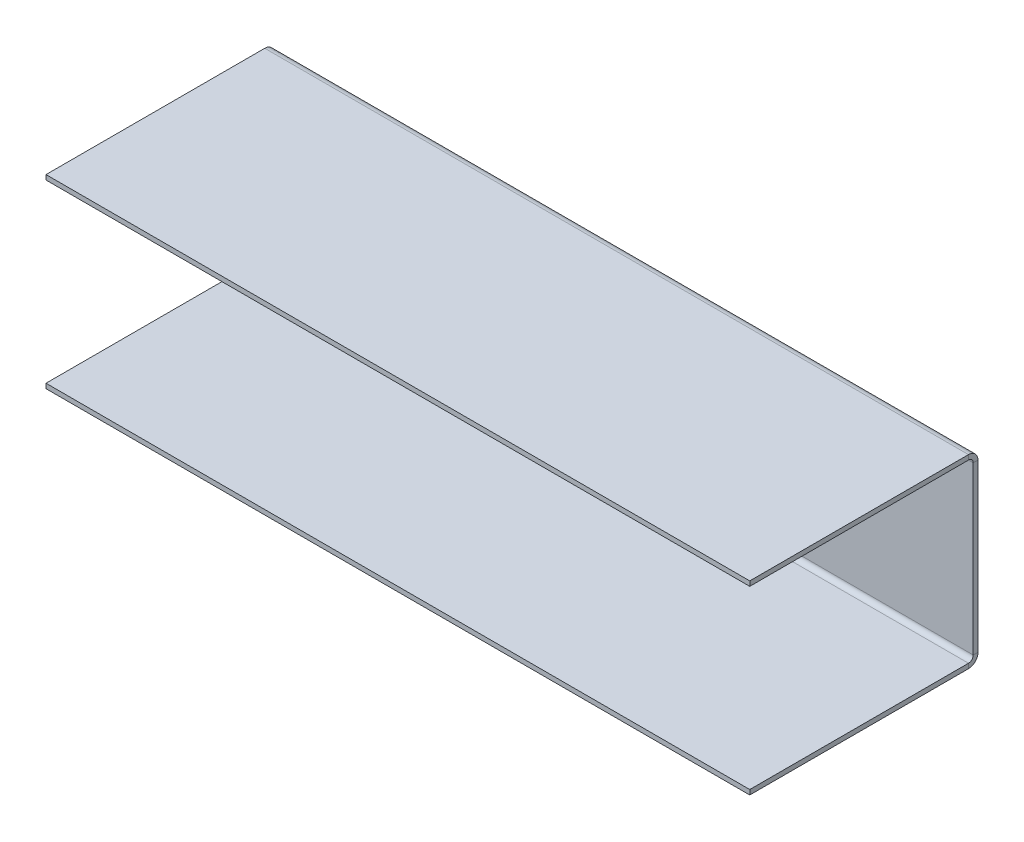
ISO-10303-21;
HEADER;
FILE_DESCRIPTION(('STEP AP214'),'2;1');
FILE_NAME('part.step','',(''),(''),'','','');
FILE_SCHEMA(('AUTOMOTIVE_DESIGN { 1 0 10303 214 1 1 1 1 }'));
ENDSEC;
DATA;
#1=APPLICATION_CONTEXT('core data for automotive mechanical design processes');
#2=APPLICATION_PROTOCOL_DEFINITION('international standard','automotive_design',2000,#1);
#3=PRODUCT_CONTEXT('',#1,'mechanical');
#4=PRODUCT('Part','Part','',(#3));
#5=PRODUCT_RELATED_PRODUCT_CATEGORY('part','',(#4));
#6=PRODUCT_DEFINITION_FORMATION('','',#4);
#7=PRODUCT_DEFINITION_CONTEXT('part definition',#1,'design');
#8=PRODUCT_DEFINITION('design','',#6,#7);
#9=PRODUCT_DEFINITION_SHAPE('','',#8);
#10=(LENGTH_UNIT() NAMED_UNIT(*) SI_UNIT(.MILLI.,.METRE.));
#11=(NAMED_UNIT(*) PLANE_ANGLE_UNIT() SI_UNIT($,.RADIAN.));
#12=(NAMED_UNIT(*) SI_UNIT($,.STERADIAN.) SOLID_ANGLE_UNIT());
#13=UNCERTAINTY_MEASURE_WITH_UNIT(LENGTH_MEASURE(1.E-05),#10,'distance_accuracy_value','');
#14=(GEOMETRIC_REPRESENTATION_CONTEXT(3) GLOBAL_UNCERTAINTY_ASSIGNED_CONTEXT((#13)) GLOBAL_UNIT_ASSIGNED_CONTEXT((#10,
#11,#12)) REPRESENTATION_CONTEXT('',''));
#15=CARTESIAN_POINT('',(0.,0.,0.));
#16=DIRECTION('',(0.,0.,1.));
#17=DIRECTION('',(1.,0.,0.));
#18=AXIS2_PLACEMENT_3D('',#15,#16,#17);
#19=CARTESIAN_POINT('',(469.9,0.,-146.05));
#20=DIRECTION('',(1.,0.,0.));
#21=DIRECTION('',(0.,0.,-1.));
#22=AXIS2_PLACEMENT_3D('',#19,#20,#21);
#23=PLANE('',#22);
#24=DIRECTION('',(0.,1.,0.));
#25=VECTOR('',#24,1.);
#26=CARTESIAN_POINT('',(469.9,0.,-146.05));
#27=LINE('',#26,#25);
#28=CARTESIAN_POINT('',(469.9,0.,-146.05));
#29=VERTEX_POINT('',#28);
#30=CARTESIAN_POINT('',(469.9,3.175,-146.05));
#31=VERTEX_POINT('',#30);
#32=EDGE_CURVE('E11',#29,#31,#27,.T.);
#33=ORIENTED_EDGE('',*,*,#32,.F.);
#34=CARTESIAN_POINT('',(469.9,6.35,-146.05));
#35=DIRECTION('',(-1.,0.,0.));
#36=DIRECTION('',(0.,0.,1.));
#37=AXIS2_PLACEMENT_3D('',#34,#35,#36);
#38=CIRCLE('',#37,6.35);
#39=CARTESIAN_POINT('',(469.9,6.35,-152.4));
#40=VERTEX_POINT('',#39);
#41=EDGE_CURVE('E147',#29,#40,#38,.F.);
#42=ORIENTED_EDGE('',*,*,#41,.T.);
#43=DIRECTION('',(0.,0.,-1.));
#44=VECTOR('',#43,1.);
#45=CARTESIAN_POINT('',(469.9,6.35,-149.225));
#46=LINE('',#45,#44);
#47=CARTESIAN_POINT('',(469.9,6.35,-149.225));
#48=VERTEX_POINT('',#47);
#49=EDGE_CURVE('E45',#48,#40,#46,.T.);
#50=ORIENTED_EDGE('',*,*,#49,.F.);
#51=CARTESIAN_POINT('',(469.9,6.35,-146.05));
#52=DIRECTION('',(1.,0.,0.));
#53=DIRECTION('',(0.,0.,-1.));
#54=AXIS2_PLACEMENT_3D('',#51,#52,#53);
#55=CIRCLE('',#54,3.175);
#56=EDGE_CURVE('E241',#31,#48,#55,.T.);
#57=ORIENTED_EDGE('',*,*,#56,.F.);
#58=EDGE_LOOP('',(#33,#42,#50,#57));
#59=FACE_BOUND('',#58,.T.);
#60=ADVANCED_FACE('F37',(#59),#23,.T.);
#61=CARTESIAN_POINT('',(469.9,6.35,-149.225));
#62=DIRECTION('',(1.,0.,0.));
#63=DIRECTION('',(0.,0.,-1.));
#64=AXIS2_PLACEMENT_3D('',#61,#62,#63);
#65=PLANE('',#64);
#66=DIRECTION('',(0.,0.,-1.));
#67=VECTOR('',#66,1.);
#68=CARTESIAN_POINT('',(469.9,0.,0.));
#69=LINE('',#68,#67);
#70=CARTESIAN_POINT('',(469.9,0.,0.));
#71=VERTEX_POINT('',#70);
#72=EDGE_CURVE('E152',#71,#29,#69,.T.);
#73=ORIENTED_EDGE('',*,*,#72,.T.);
#74=ORIENTED_EDGE('',*,*,#32,.T.);
#75=DIRECTION('',(0.,0.,-1.));
#76=VECTOR('',#75,1.);
#77=CARTESIAN_POINT('',(469.9,3.175,0.));
#78=LINE('',#77,#76);
#79=CARTESIAN_POINT('',(469.9,3.175,0.));
#80=VERTEX_POINT('',#79);
#81=EDGE_CURVE('E254',#80,#31,#78,.T.);
#82=ORIENTED_EDGE('',*,*,#81,.F.);
#83=DIRECTION('',(0.,1.,0.));
#84=VECTOR('',#83,1.);
#85=CARTESIAN_POINT('',(469.9,0.,0.));
#86=LINE('',#85,#84);
#87=EDGE_CURVE('E256',#71,#80,#86,.T.);
#88=ORIENTED_EDGE('',*,*,#87,.F.);
#89=EDGE_LOOP('',(#73,#74,#82,#88));
#90=FACE_BOUND('',#89,.T.);
#91=ADVANCED_FACE('F267',(#90),#65,.T.);
#92=CARTESIAN_POINT('',(0.,6.35,-152.4));
#93=DIRECTION('',(-1.,0.,0.));
#94=DIRECTION('',(0.,0.,1.));
#95=AXIS2_PLACEMENT_3D('',#92,#93,#94);
#96=PLANE('',#95);
#97=DIRECTION('',(0.,0.,1.));
#98=VECTOR('',#97,1.);
#99=CARTESIAN_POINT('',(0.,6.35,-152.4));
#100=LINE('',#99,#98);
#101=CARTESIAN_POINT('',(0.,6.35,-152.4));
#102=VERTEX_POINT('',#101);
#103=CARTESIAN_POINT('',(0.,6.35,-149.225));
#104=VERTEX_POINT('',#103);
#105=EDGE_CURVE('E145',#102,#104,#100,.T.);
#106=ORIENTED_EDGE('',*,*,#105,.F.);
#107=CARTESIAN_POINT('',(0.,6.35,-146.05));
#108=DIRECTION('',(-1.,0.,0.));
#109=DIRECTION('',(0.,0.,1.));
#110=AXIS2_PLACEMENT_3D('',#107,#108,#109);
#111=CIRCLE('',#110,6.35);
#112=CARTESIAN_POINT('',(0.,0.,-146.05));
#113=VERTEX_POINT('',#112);
#114=EDGE_CURVE('E159',#113,#102,#111,.F.);
#115=ORIENTED_EDGE('',*,*,#114,.F.);
#116=DIRECTION('',(0.,-1.,0.));
#117=VECTOR('',#116,1.);
#118=CARTESIAN_POINT('',(0.,3.175,-146.05));
#119=LINE('',#118,#117);
#120=CARTESIAN_POINT('',(0.,3.175,-146.05));
#121=VERTEX_POINT('',#120);
#122=EDGE_CURVE('E232',#121,#113,#119,.T.);
#123=ORIENTED_EDGE('',*,*,#122,.F.);
#124=CARTESIAN_POINT('',(0.,6.35,-146.05));
#125=DIRECTION('',(1.,0.,0.));
#126=DIRECTION('',(0.,0.,-1.));
#127=AXIS2_PLACEMENT_3D('',#124,#125,#126);
#128=CIRCLE('',#127,3.175);
#129=EDGE_CURVE('E186',#121,#104,#128,.T.);
#130=ORIENTED_EDGE('',*,*,#129,.T.);
#131=EDGE_LOOP('',(#106,#115,#123,#130));
#132=FACE_BOUND('',#131,.T.);
#133=ADVANCED_FACE('F246',(#132),#96,.T.);
#134=CARTESIAN_POINT('',(0.,3.175,-146.05));
#135=DIRECTION('',(-1.,0.,0.));
#136=DIRECTION('',(0.,0.,1.));
#137=AXIS2_PLACEMENT_3D('',#134,#135,#136);
#138=PLANE('',#137);
#139=DIRECTION('',(0.,1.,0.));
#140=VECTOR('',#139,1.);
#141=CARTESIAN_POINT('',(0.,0.,-152.4));
#142=LINE('',#141,#140);
#143=CARTESIAN_POINT('',(0.,117.475,-152.4));
#144=VERTEX_POINT('',#143);
#145=EDGE_CURVE('E199',#102,#144,#142,.T.);
#146=ORIENTED_EDGE('',*,*,#145,.F.);
#147=ORIENTED_EDGE('',*,*,#105,.T.);
#148=DIRECTION('',(0.,1.,0.));
#149=VECTOR('',#148,1.);
#150=CARTESIAN_POINT('',(0.,0.,-149.225));
#151=LINE('',#150,#149);
#152=CARTESIAN_POINT('',(0.,117.475,-149.225));
#153=VERTEX_POINT('',#152);
#154=EDGE_CURVE('E184',#104,#153,#151,.T.);
#155=ORIENTED_EDGE('',*,*,#154,.T.);
#156=DIRECTION('',(0.,0.,-1.));
#157=VECTOR('',#156,1.);
#158=CARTESIAN_POINT('',(0.,117.475,-149.225));
#159=LINE('',#158,#157);
#160=EDGE_CURVE('E94',#153,#144,#159,.T.);
#161=ORIENTED_EDGE('',*,*,#160,.T.);
#162=EDGE_LOOP('',(#146,#147,#155,#161));
#163=FACE_BOUND('',#162,.T.);
#164=ADVANCED_FACE('F234',(#163),#138,.T.);
#165=CARTESIAN_POINT('',(469.9,117.475,-152.4));
#166=DIRECTION('',(1.,0.,0.));
#167=DIRECTION('',(0.,0.,-1.));
#168=AXIS2_PLACEMENT_3D('',#165,#166,#167);
#169=PLANE('',#168);
#170=DIRECTION('',(0.,0.,1.));
#171=VECTOR('',#170,1.);
#172=CARTESIAN_POINT('',(469.9,117.475,-152.4));
#173=LINE('',#172,#171);
#174=CARTESIAN_POINT('',(469.9,117.475,-152.4));
#175=VERTEX_POINT('',#174);
#176=CARTESIAN_POINT('',(469.9,117.475,-149.225));
#177=VERTEX_POINT('',#176);
#178=EDGE_CURVE('E230',#175,#177,#173,.T.);
#179=ORIENTED_EDGE('',*,*,#178,.F.);
#180=CARTESIAN_POINT('',(469.9,117.475,-146.05));
#181=DIRECTION('',(-1.,0.,0.));
#182=DIRECTION('',(0.,0.,1.));
#183=AXIS2_PLACEMENT_3D('',#180,#181,#182);
#184=CIRCLE('',#183,6.35);
#185=CARTESIAN_POINT('',(469.9,123.825,-146.05));
#186=VERTEX_POINT('',#185);
#187=EDGE_CURVE('E167',#175,#186,#184,.F.);
#188=ORIENTED_EDGE('',*,*,#187,.T.);
#189=DIRECTION('',(0.,1.,0.));
#190=VECTOR('',#189,1.);
#191=CARTESIAN_POINT('',(469.9,120.65,-146.05));
#192=LINE('',#191,#190);
#193=CARTESIAN_POINT('',(469.9,120.65,-146.05));
#194=VERTEX_POINT('',#193);
#195=EDGE_CURVE('E53',#194,#186,#192,.T.);
#196=ORIENTED_EDGE('',*,*,#195,.F.);
#197=CARTESIAN_POINT('',(469.9,117.475,-146.05));
#198=DIRECTION('',(1.,0.,0.));
#199=DIRECTION('',(0.,0.,-1.));
#200=AXIS2_PLACEMENT_3D('',#197,#198,#199);
#201=CIRCLE('',#200,3.175);
#202=EDGE_CURVE('E258',#177,#194,#201,.T.);
#203=ORIENTED_EDGE('',*,*,#202,.F.);
#204=EDGE_LOOP('',(#179,#188,#196,#203));
#205=FACE_BOUND('',#204,.T.);
#206=ADVANCED_FACE('F293',(#205),#169,.T.);
#207=CARTESIAN_POINT('',(469.9,120.65,-146.05));
#208=DIRECTION('',(1.,0.,0.));
#209=DIRECTION('',(0.,0.,-1.));
#210=AXIS2_PLACEMENT_3D('',#207,#208,#209);
#211=PLANE('',#210);
#212=DIRECTION('',(0.,1.,0.));
#213=VECTOR('',#212,1.);
#214=CARTESIAN_POINT('',(469.9,0.,-152.4));
#215=LINE('',#214,#213);
#216=EDGE_CURVE('E137',#40,#175,#215,.T.);
#217=ORIENTED_EDGE('',*,*,#216,.T.);
#218=ORIENTED_EDGE('',*,*,#178,.T.);
#219=DIRECTION('',(0.,1.,0.));
#220=VECTOR('',#219,1.);
#221=CARTESIAN_POINT('',(469.9,0.,-149.225));
#222=LINE('',#221,#220);
#223=EDGE_CURVE('E140',#48,#177,#222,.T.);
#224=ORIENTED_EDGE('',*,*,#223,.F.);
#225=ORIENTED_EDGE('',*,*,#49,.T.);
#226=EDGE_LOOP('',(#217,#218,#224,#225));
#227=FACE_BOUND('',#226,.T.);
#228=ADVANCED_FACE('F135',(#227),#211,.T.);
#229=CARTESIAN_POINT('',(0.,123.825,-146.05));
#230=DIRECTION('',(-1.,0.,0.));
#231=DIRECTION('',(0.,0.,1.));
#232=AXIS2_PLACEMENT_3D('',#229,#230,#231);
#233=PLANE('',#232);
#234=DIRECTION('',(0.,-1.,0.));
#235=VECTOR('',#234,1.);
#236=CARTESIAN_POINT('',(0.,123.825,-146.05));
#237=LINE('',#236,#235);
#238=CARTESIAN_POINT('',(0.,123.825,-146.05));
#239=VERTEX_POINT('',#238);
#240=CARTESIAN_POINT('',(0.,120.65,-146.05));
#241=VERTEX_POINT('',#240);
#242=EDGE_CURVE('E101',#239,#241,#237,.T.);
#243=ORIENTED_EDGE('',*,*,#242,.F.);
#244=CARTESIAN_POINT('',(0.,117.475,-146.05));
#245=DIRECTION('',(-1.,0.,0.));
#246=DIRECTION('',(0.,0.,1.));
#247=AXIS2_PLACEMENT_3D('',#244,#245,#246);
#248=CIRCLE('',#247,6.35);
#249=EDGE_CURVE('E201',#144,#239,#248,.F.);
#250=ORIENTED_EDGE('',*,*,#249,.F.);
#251=ORIENTED_EDGE('',*,*,#160,.F.);
#252=CARTESIAN_POINT('',(0.,117.475,-146.05));
#253=DIRECTION('',(1.,0.,0.));
#254=DIRECTION('',(0.,0.,-1.));
#255=AXIS2_PLACEMENT_3D('',#252,#253,#254);
#256=CIRCLE('',#255,3.175);
#257=EDGE_CURVE('E182',#153,#241,#256,.T.);
#258=ORIENTED_EDGE('',*,*,#257,.T.);
#259=EDGE_LOOP('',(#243,#250,#251,#258));
#260=FACE_BOUND('',#259,.T.);
#261=ADVANCED_FACE('F299',(#260),#233,.T.);
#262=CARTESIAN_POINT('',(0.,117.475,-149.225));
#263=DIRECTION('',(-1.,0.,0.));
#264=DIRECTION('',(0.,0.,1.));
#265=AXIS2_PLACEMENT_3D('',#262,#263,#264);
#266=PLANE('',#265);
#267=DIRECTION('',(0.,0.,1.));
#268=VECTOR('',#267,1.);
#269=CARTESIAN_POINT('',(0.,123.825,-152.4));
#270=LINE('',#269,#268);
#271=CARTESIAN_POINT('',(0.,123.825,0.));
#272=VERTEX_POINT('',#271);
#273=EDGE_CURVE('E173',#239,#272,#270,.T.);
#274=ORIENTED_EDGE('',*,*,#273,.F.);
#275=ORIENTED_EDGE('',*,*,#242,.T.);
#276=DIRECTION('',(0.,0.,-1.));
#277=VECTOR('',#276,1.);
#278=CARTESIAN_POINT('',(0.,120.65,-152.4));
#279=LINE('',#278,#277);
#280=CARTESIAN_POINT('',(0.,120.65,0.));
#281=VERTEX_POINT('',#280);
#282=EDGE_CURVE('E179',#241,#281,#279,.F.);
#283=ORIENTED_EDGE('',*,*,#282,.T.);
#284=DIRECTION('',(0.,1.,0.));
#285=VECTOR('',#284,1.);
#286=CARTESIAN_POINT('',(0.,120.65,0.));
#287=LINE('',#286,#285);
#288=EDGE_CURVE('E176',#281,#272,#287,.T.);
#289=ORIENTED_EDGE('',*,*,#288,.T.);
#290=EDGE_LOOP('',(#274,#275,#283,#289));
#291=FACE_BOUND('',#290,.T.);
#292=ADVANCED_FACE('F302',(#291),#266,.T.);
#293=CARTESIAN_POINT('',(469.9,123.825,-152.4));
#294=DIRECTION('',(0.,-1.,0.));
#295=DIRECTION('',(0.,0.,-1.));
#296=AXIS2_PLACEMENT_3D('',#293,#294,#295);
#297=PLANE('',#296);
#298=ORIENTED_EDGE('',*,*,#273,.T.);
#299=DIRECTION('',(-1.,0.,0.));
#300=VECTOR('',#299,1.);
#301=CARTESIAN_POINT('',(469.9,123.825,0.));
#302=LINE('',#301,#300);
#303=CARTESIAN_POINT('',(469.9,123.825,0.));
#304=VERTEX_POINT('',#303);
#305=EDGE_CURVE('E225',#304,#272,#302,.T.);
#306=ORIENTED_EDGE('',*,*,#305,.F.);
#307=DIRECTION('',(0.,0.,1.));
#308=VECTOR('',#307,1.);
#309=CARTESIAN_POINT('',(469.9,123.825,-152.4));
#310=LINE('',#309,#308);
#311=EDGE_CURVE('E107',#186,#304,#310,.T.);
#312=ORIENTED_EDGE('',*,*,#311,.F.);
#313=DIRECTION('',(-1.,0.,0.));
#314=VECTOR('',#313,1.);
#315=CARTESIAN_POINT('',(469.9,123.825,-146.05));
#316=LINE('',#315,#314);
#317=EDGE_CURVE('E169',#186,#239,#316,.T.);
#318=ORIENTED_EDGE('',*,*,#317,.T.);
#319=EDGE_LOOP('',(#298,#306,#312,#318));
#320=FACE_BOUND('',#319,.T.);
#321=ADVANCED_FACE('F305',(#320),#297,.F.);
#322=CARTESIAN_POINT('',(469.9,120.65,0.));
#323=DIRECTION('',(0.,0.,1.));
#324=DIRECTION('',(0.,-1.,0.));
#325=AXIS2_PLACEMENT_3D('',#322,#323,#324);
#326=PLANE('',#325);
#327=ORIENTED_EDGE('',*,*,#288,.F.);
#328=DIRECTION('',(-1.,0.,0.));
#329=VECTOR('',#328,1.);
#330=CARTESIAN_POINT('',(469.9,120.65,0.));
#331=LINE('',#330,#329);
#332=CARTESIAN_POINT('',(469.9,120.65,0.));
#333=VERTEX_POINT('',#332);
#334=EDGE_CURVE('E223',#333,#281,#331,.T.);
#335=ORIENTED_EDGE('',*,*,#334,.F.);
#336=DIRECTION('',(0.,1.,0.));
#337=VECTOR('',#336,1.);
#338=CARTESIAN_POINT('',(469.9,120.65,0.));
#339=LINE('',#338,#337);
#340=EDGE_CURVE('E513',#333,#304,#339,.T.);
#341=ORIENTED_EDGE('',*,*,#340,.T.);
#342=ORIENTED_EDGE('',*,*,#305,.T.);
#343=EDGE_LOOP('',(#327,#335,#341,#342));
#344=FACE_BOUND('',#343,.T.);
#345=ADVANCED_FACE('F309',(#344),#326,.T.);
#346=CARTESIAN_POINT('',(469.9,120.65,-152.4));
#347=DIRECTION('',(0.,-1.,0.));
#348=DIRECTION('',(0.,0.,-1.));
#349=AXIS2_PLACEMENT_3D('',#346,#347,#348);
#350=PLANE('',#349);
#351=ORIENTED_EDGE('',*,*,#282,.F.);
#352=DIRECTION('',(-1.,0.,0.));
#353=VECTOR('',#352,1.);
#354=CARTESIAN_POINT('',(469.9,120.65,-146.05));
#355=LINE('',#354,#353);
#356=EDGE_CURVE('E220',#194,#241,#355,.T.);
#357=ORIENTED_EDGE('',*,*,#356,.F.);
#358=DIRECTION('',(0.,0.,-1.));
#359=VECTOR('',#358,1.);
#360=CARTESIAN_POINT('',(469.9,120.65,-152.4));
#361=LINE('',#360,#359);
#362=EDGE_CURVE('E515',#194,#333,#361,.F.);
#363=ORIENTED_EDGE('',*,*,#362,.T.);
#364=ORIENTED_EDGE('',*,*,#334,.T.);
#365=EDGE_LOOP('',(#351,#357,#363,#364));
#366=FACE_BOUND('',#365,.T.);
#367=ADVANCED_FACE('F313',(#366),#350,.T.);
#368=CARTESIAN_POINT('',(469.9,117.475,-146.05));
#369=DIRECTION('',(-1.,0.,0.));
#370=DIRECTION('',(0.,0.,1.));
#371=AXIS2_PLACEMENT_3D('',#368,#369,#370);
#372=CYLINDRICAL_SURFACE('',#371,3.175);
#373=ORIENTED_EDGE('',*,*,#257,.F.);
#374=DIRECTION('',(-1.,0.,0.));
#375=VECTOR('',#374,1.);
#376=CARTESIAN_POINT('',(469.9,117.475,-149.225));
#377=LINE('',#376,#375);
#378=EDGE_CURVE('E217',#177,#153,#377,.T.);
#379=ORIENTED_EDGE('',*,*,#378,.F.);
#380=ORIENTED_EDGE('',*,*,#202,.T.);
#381=ORIENTED_EDGE('',*,*,#356,.T.);
#382=EDGE_LOOP('',(#373,#379,#380,#381));
#383=FACE_BOUND('',#382,.T.);
#384=ADVANCED_FACE('F317',(#383),#372,.F.);
#385=CARTESIAN_POINT('',(469.9,0.,-149.225));
#386=DIRECTION('',(0.,0.,1.));
#387=DIRECTION('',(1.,0.,0.));
#388=AXIS2_PLACEMENT_3D('',#385,#386,#387);
#389=PLANE('',#388);
#390=ORIENTED_EDGE('',*,*,#154,.F.);
#391=DIRECTION('',(-1.,0.,0.));
#392=VECTOR('',#391,1.);
#393=CARTESIAN_POINT('',(469.9,6.35,-149.225));
#394=LINE('',#393,#392);
#395=EDGE_CURVE('E214',#48,#104,#394,.T.);
#396=ORIENTED_EDGE('',*,*,#395,.F.);
#397=ORIENTED_EDGE('',*,*,#223,.T.);
#398=ORIENTED_EDGE('',*,*,#378,.T.);
#399=EDGE_LOOP('',(#390,#396,#397,#398));
#400=FACE_BOUND('',#399,.T.);
#401=ADVANCED_FACE('F243',(#400),#389,.T.);
#402=CARTESIAN_POINT('',(469.9,6.35,-146.05));
#403=DIRECTION('',(-1.,0.,0.));
#404=DIRECTION('',(0.,0.,1.));
#405=AXIS2_PLACEMENT_3D('',#402,#403,#404);
#406=CYLINDRICAL_SURFACE('',#405,3.175);
#407=ORIENTED_EDGE('',*,*,#129,.F.);
#408=DIRECTION('',(-1.,0.,0.));
#409=VECTOR('',#408,1.);
#410=CARTESIAN_POINT('',(469.9,3.175,-146.05));
#411=LINE('',#410,#409);
#412=EDGE_CURVE('E211',#31,#121,#411,.T.);
#413=ORIENTED_EDGE('',*,*,#412,.F.);
#414=ORIENTED_EDGE('',*,*,#56,.T.);
#415=ORIENTED_EDGE('',*,*,#395,.T.);
#416=EDGE_LOOP('',(#407,#413,#414,#415));
#417=FACE_BOUND('',#416,.T.);
#418=ADVANCED_FACE('F239',(#417),#406,.F.);
#419=CARTESIAN_POINT('',(469.9,3.175,0.));
#420=DIRECTION('',(0.,1.,0.));
#421=DIRECTION('',(0.,0.,1.));
#422=AXIS2_PLACEMENT_3D('',#419,#420,#421);
#423=PLANE('',#422);
#424=DIRECTION('',(0.,0.,-1.));
#425=VECTOR('',#424,1.);
#426=CARTESIAN_POINT('',(0.,3.175,0.));
#427=LINE('',#426,#425);
#428=CARTESIAN_POINT('',(0.,3.175,0.));
#429=VERTEX_POINT('',#428);
#430=EDGE_CURVE('E189',#429,#121,#427,.T.);
#431=ORIENTED_EDGE('',*,*,#430,.F.);
#432=DIRECTION('',(-1.,0.,0.));
#433=VECTOR('',#432,1.);
#434=CARTESIAN_POINT('',(469.9,3.175,0.));
#435=LINE('',#434,#433);
#436=EDGE_CURVE('E209',#80,#429,#435,.T.);
#437=ORIENTED_EDGE('',*,*,#436,.F.);
#438=ORIENTED_EDGE('',*,*,#81,.T.);
#439=ORIENTED_EDGE('',*,*,#412,.T.);
#440=EDGE_LOOP('',(#431,#437,#438,#439));
#441=FACE_BOUND('',#440,.T.);
#442=ADVANCED_FACE('F252',(#441),#423,.T.);
#443=CARTESIAN_POINT('',(469.9,0.,0.));
#444=DIRECTION('',(0.,0.,1.));
#445=DIRECTION('',(1.,0.,0.));
#446=AXIS2_PLACEMENT_3D('',#443,#444,#445);
#447=PLANE('',#446);
#448=DIRECTION('',(0.,1.,0.));
#449=VECTOR('',#448,1.);
#450=CARTESIAN_POINT('',(0.,0.,0.));
#451=LINE('',#450,#449);
#452=CARTESIAN_POINT('',(0.,0.,0.));
#453=VERTEX_POINT('',#452);
#454=EDGE_CURVE('E192',#453,#429,#451,.T.);
#455=ORIENTED_EDGE('',*,*,#454,.F.);
#456=DIRECTION('',(-1.,0.,0.));
#457=VECTOR('',#456,1.);
#458=CARTESIAN_POINT('',(469.9,0.,0.));
#459=LINE('',#458,#457);
#460=EDGE_CURVE('E207',#71,#453,#459,.T.);
#461=ORIENTED_EDGE('',*,*,#460,.F.);
#462=ORIENTED_EDGE('',*,*,#87,.T.);
#463=ORIENTED_EDGE('',*,*,#436,.T.);
#464=EDGE_LOOP('',(#455,#461,#462,#463));
#465=FACE_BOUND('',#464,.T.);
#466=ADVANCED_FACE('F273',(#465),#447,.T.);
#467=CARTESIAN_POINT('',(469.9,0.,0.));
#468=DIRECTION('',(0.,1.,0.));
#469=DIRECTION('',(0.,0.,1.));
#470=AXIS2_PLACEMENT_3D('',#467,#468,#469);
#471=PLANE('',#470);
#472=DIRECTION('',(0.,0.,-1.));
#473=VECTOR('',#472,1.);
#474=CARTESIAN_POINT('',(0.,0.,0.));
#475=LINE('',#474,#473);
#476=EDGE_CURVE('E195',#453,#113,#475,.T.);
#477=ORIENTED_EDGE('',*,*,#476,.T.);
#478=DIRECTION('',(-1.,0.,0.));
#479=VECTOR('',#478,1.);
#480=CARTESIAN_POINT('',(469.9,0.,-146.05));
#481=LINE('',#480,#479);
#482=EDGE_CURVE('E161',#29,#113,#481,.T.);
#483=ORIENTED_EDGE('',*,*,#482,.F.);
#484=ORIENTED_EDGE('',*,*,#72,.F.);
#485=ORIENTED_EDGE('',*,*,#460,.T.);
#486=EDGE_LOOP('',(#477,#483,#484,#485));
#487=FACE_BOUND('',#486,.T.);
#488=ADVANCED_FACE('F269',(#487),#471,.F.);
#489=CARTESIAN_POINT('',(469.9,6.35,-146.05));
#490=DIRECTION('',(-1.,0.,0.));
#491=DIRECTION('',(0.,0.,1.));
#492=AXIS2_PLACEMENT_3D('',#489,#490,#491);
#493=CYLINDRICAL_SURFACE('',#492,6.35);
#494=ORIENTED_EDGE('',*,*,#114,.T.);
#495=DIRECTION('',(-1.,0.,0.));
#496=VECTOR('',#495,1.);
#497=CARTESIAN_POINT('',(469.9,6.35,-152.4));
#498=LINE('',#497,#496);
#499=EDGE_CURVE('E156',#40,#102,#498,.T.);
#500=ORIENTED_EDGE('',*,*,#499,.F.);
#501=ORIENTED_EDGE('',*,*,#41,.F.);
#502=ORIENTED_EDGE('',*,*,#482,.T.);
#503=EDGE_LOOP('',(#494,#500,#501,#502));
#504=FACE_BOUND('',#503,.T.);
#505=ADVANCED_FACE('F157',(#504),#493,.T.);
#506=CARTESIAN_POINT('',(469.9,0.,-152.4));
#507=DIRECTION('',(0.,0.,1.));
#508=DIRECTION('',(1.,0.,0.));
#509=AXIS2_PLACEMENT_3D('',#506,#507,#508);
#510=PLANE('',#509);
#511=ORIENTED_EDGE('',*,*,#145,.T.);
#512=DIRECTION('',(-1.,0.,0.));
#513=VECTOR('',#512,1.);
#514=CARTESIAN_POINT('',(469.9,117.475,-152.4));
#515=LINE('',#514,#513);
#516=EDGE_CURVE('E162',#175,#144,#515,.T.);
#517=ORIENTED_EDGE('',*,*,#516,.F.);
#518=ORIENTED_EDGE('',*,*,#216,.F.);
#519=ORIENTED_EDGE('',*,*,#499,.T.);
#520=EDGE_LOOP('',(#511,#517,#518,#519));
#521=FACE_BOUND('',#520,.T.);
#522=ADVANCED_FACE('F164',(#521),#510,.F.);
#523=CARTESIAN_POINT('',(469.9,117.475,-146.05));
#524=DIRECTION('',(-1.,0.,0.));
#525=DIRECTION('',(0.,0.,1.));
#526=AXIS2_PLACEMENT_3D('',#523,#524,#525);
#527=CYLINDRICAL_SURFACE('',#526,6.35);
#528=ORIENTED_EDGE('',*,*,#249,.T.);
#529=ORIENTED_EDGE('',*,*,#317,.F.);
#530=ORIENTED_EDGE('',*,*,#187,.F.);
#531=ORIENTED_EDGE('',*,*,#516,.T.);
#532=EDGE_LOOP('',(#528,#529,#530,#531));
#533=FACE_BOUND('',#532,.T.);
#534=ADVANCED_FACE('F364',(#533),#527,.T.);
#535=CARTESIAN_POINT('',(469.9,117.475,-146.05));
#536=DIRECTION('',(1.,0.,0.));
#537=DIRECTION('',(0.,0.,-1.));
#538=AXIS2_PLACEMENT_3D('',#535,#536,#537);
#539=PLANE('',#538);
#540=ORIENTED_EDGE('',*,*,#311,.T.);
#541=ORIENTED_EDGE('',*,*,#340,.F.);
#542=ORIENTED_EDGE('',*,*,#362,.F.);
#543=ORIENTED_EDGE('',*,*,#195,.T.);
#544=EDGE_LOOP('',(#540,#541,#542,#543));
#545=FACE_BOUND('',#544,.T.);
#546=ADVANCED_FACE('F374',(#545),#539,.T.);
#547=CARTESIAN_POINT('',(0.,117.475,-146.05));
#548=DIRECTION('',(1.,0.,0.));
#549=DIRECTION('',(0.,0.,-1.));
#550=AXIS2_PLACEMENT_3D('',#547,#548,#549);
#551=PLANE('',#550);
#552=ORIENTED_EDGE('',*,*,#430,.T.);
#553=ORIENTED_EDGE('',*,*,#122,.T.);
#554=ORIENTED_EDGE('',*,*,#476,.F.);
#555=ORIENTED_EDGE('',*,*,#454,.T.);
#556=EDGE_LOOP('',(#552,#553,#554,#555));
#557=FACE_BOUND('',#556,.T.);
#558=ADVANCED_FACE('F271',(#557),#551,.F.);
#559=CLOSED_SHELL('',(#60,#91,#133,#164,#206,#228,#261,#292,#321,#345,#367,#384,#401,#418,#442,
#466,#488,#505,#522,#534,#546,#558));
#560=MANIFOLD_SOLID_BREP('B2',#559);
#561=ADVANCED_BREP_SHAPE_REPRESENTATION('',(#18,#560),#14);
#562=SHAPE_DEFINITION_REPRESENTATION(#9,#561);
ENDSEC;
END-ISO-10303-21;
